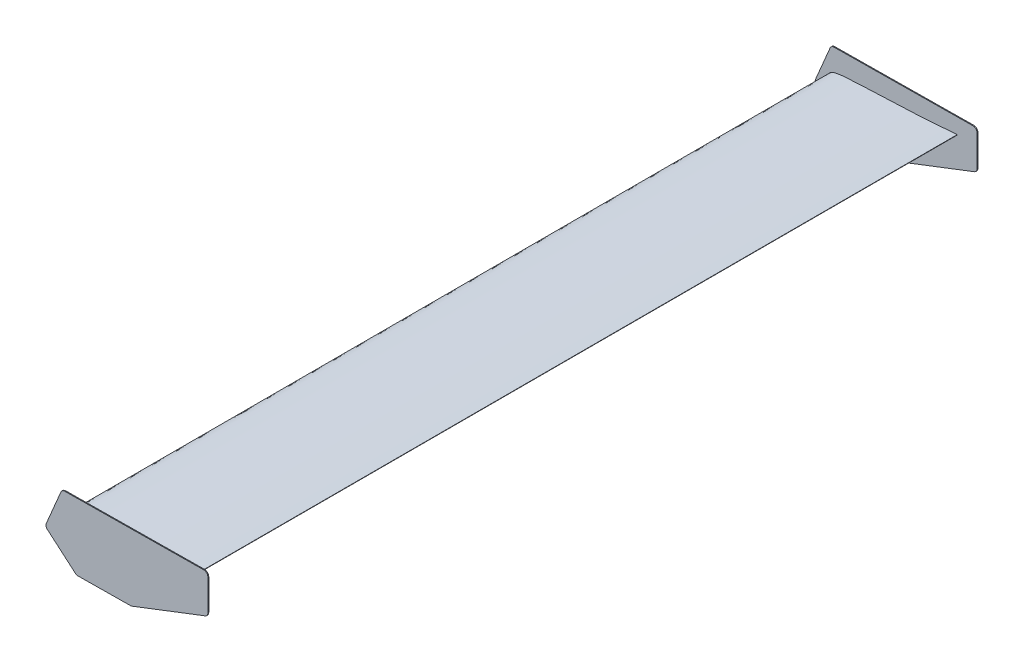
ISO-10303-21;
HEADER;
FILE_DESCRIPTION(('STEP AP214'),'2;1');
FILE_NAME('part.step','',(''),(''),'','','');
FILE_SCHEMA(('AUTOMOTIVE_DESIGN { 1 0 10303 214 1 1 1 1 }'));
ENDSEC;
DATA;
#1=APPLICATION_CONTEXT('core data for automotive mechanical design processes');
#2=APPLICATION_PROTOCOL_DEFINITION('international standard','automotive_design',2000,#1);
#3=PRODUCT_CONTEXT('',#1,'mechanical');
#4=PRODUCT('Part','Part','',(#3));
#5=PRODUCT_RELATED_PRODUCT_CATEGORY('part','',(#4));
#6=PRODUCT_DEFINITION_FORMATION('','',#4);
#7=PRODUCT_DEFINITION_CONTEXT('part definition',#1,'design');
#8=PRODUCT_DEFINITION('design','',#6,#7);
#9=PRODUCT_DEFINITION_SHAPE('','',#8);
#10=(LENGTH_UNIT() NAMED_UNIT(*) SI_UNIT(.MILLI.,.METRE.));
#11=(NAMED_UNIT(*) PLANE_ANGLE_UNIT() SI_UNIT($,.RADIAN.));
#12=(NAMED_UNIT(*) SI_UNIT($,.STERADIAN.) SOLID_ANGLE_UNIT());
#13=UNCERTAINTY_MEASURE_WITH_UNIT(LENGTH_MEASURE(1.E-05),#10,'distance_accuracy_value','');
#14=(GEOMETRIC_REPRESENTATION_CONTEXT(3) GLOBAL_UNCERTAINTY_ASSIGNED_CONTEXT((#13)) GLOBAL_UNIT_ASSIGNED_CONTEXT((#10,
#11,#12)) REPRESENTATION_CONTEXT('',''));
#15=CARTESIAN_POINT('',(0.,0.,0.));
#16=DIRECTION('',(0.,0.,1.));
#17=DIRECTION('',(1.,0.,0.));
#18=AXIS2_PLACEMENT_3D('',#15,#16,#17);
#19=CARTESIAN_POINT('',(0.,0.,899.));
#20=DIRECTION('',(0.,0.,-1.));
#21=DIRECTION('',(-1.,0.,0.));
#22=AXIS2_PLACEMENT_3D('',#19,#20,#21);
#23=PLANE('',#22);
#24=DIRECTION('',(-0.999947428083981,-0.0102538318804609,0.));
#25=VECTOR('',#24,1.);
#26=CARTESIAN_POINT('',(4.19836461655942,59.4066569608688,899.));
#27=LINE('',#26,#25);
#28=CARTESIAN_POINT('',(335.564783335885,62.8046111462092,899.));
#29=VERTEX_POINT('',#28);
#30=CARTESIAN_POINT('',(10.7496298097369,59.4738360644981,899.));
#31=VERTEX_POINT('',#30);
#32=EDGE_CURVE('E240',#29,#31,#27,.T.);
#33=ORIENTED_EDGE('',*,*,#32,.F.);
#34=CARTESIAN_POINT('',(335.667321654689,52.8051368653694,899.));
#35=DIRECTION('',(0.,0.,-1.));
#36=DIRECTION('',(-1.,0.,0.));
#37=AXIS2_PLACEMENT_3D('',#34,#35,#36);
#38=CIRCLE('',#37,10.);
#39=CARTESIAN_POINT('',(345.667321654689,52.8051368653694,899.));
#40=VERTEX_POINT('',#39);
#41=EDGE_CURVE('E277',#29,#40,#38,.T.);
#42=ORIENTED_EDGE('',*,*,#41,.T.);
#43=DIRECTION('',(0.,1.,0.));
#44=VECTOR('',#43,1.);
#45=CARTESIAN_POINT('',(345.667321654689,62.908206321893,899.));
#46=LINE('',#45,#44);
#47=CARTESIAN_POINT('',(345.667321654689,-19.4543841415105,899.));
#48=VERTEX_POINT('',#47);
#49=EDGE_CURVE('E439',#48,#40,#46,.T.);
#50=ORIENTED_EDGE('',*,*,#49,.F.);
#51=CARTESIAN_POINT('',(335.667321654689,-19.4543841415105,899.));
#52=DIRECTION('',(0.,0.,-1.));
#53=DIRECTION('',(-1.,0.,0.));
#54=AXIS2_PLACEMENT_3D('',#51,#52,#53);
#55=CIRCLE('',#54,10.);
#56=CARTESIAN_POINT('',(339.261892028957,-28.7860004979859,899.));
#57=VERTEX_POINT('',#56);
#58=EDGE_CURVE('E274',#48,#57,#55,.T.);
#59=ORIENTED_EDGE('',*,*,#58,.T.);
#60=DIRECTION('',(0.93316163564754,0.35945703742674,0.));
#61=VECTOR('',#60,1.);
#62=CARTESIAN_POINT('',(166.275090380422,-95.4211051348804,899.));
#63=LINE('',#62,#61);
#64=CARTESIAN_POINT('',(167.960784377593,-94.7717700710672,899.));
#65=VERTEX_POINT('',#64);
#66=EDGE_CURVE('E474',#65,#57,#63,.T.);
#67=ORIENTED_EDGE('',*,*,#66,.F.);
#68=CARTESIAN_POINT('',(164.366214003326,-85.4401537145918,899.));
#69=DIRECTION('',(0.,0.,-1.));
#70=DIRECTION('',(-1.,0.,0.));
#71=AXIS2_PLACEMENT_3D('',#68,#69,#70);
#72=CIRCLE('',#71,10.);
#73=CARTESIAN_POINT('',(164.46875232213,-95.4396279954316,899.));
#74=VERTEX_POINT('',#73);
#75=EDGE_CURVE('E271',#65,#74,#72,.T.);
#76=ORIENTED_EDGE('',*,*,#75,.T.);
#77=DIRECTION('',(0.99994742808398,0.010253831880461,0.));
#78=VECTOR('',#77,1.);
#79=CARTESIAN_POINT('',(38.2575012573376,-96.7338449847395,899.));
#80=LINE('',#79,#78);
#81=CARTESIAN_POINT('',(42.0078617050286,-96.6953873974287,899.));
#82=VERTEX_POINT('',#81);
#83=EDGE_CURVE('E470',#82,#74,#80,.T.);
#84=ORIENTED_EDGE('',*,*,#83,.F.);
#85=CARTESIAN_POINT('',(41.905323386224,-86.6959131165889,899.));
#86=DIRECTION('',(0.,0.,-1.));
#87=DIRECTION('',(-1.,0.,0.));
#88=AXIS2_PLACEMENT_3D('',#85,#86,#87);
#89=CIRCLE('',#88,10.);
#90=CARTESIAN_POINT('',(35.4068383285812,-94.2965507185006,899.));
#91=VERTEX_POINT('',#90);
#92=EDGE_CURVE('E262',#82,#91,#89,.T.);
#93=ORIENTED_EDGE('',*,*,#92,.T.);
#94=DIRECTION('',(0.760063760191166,-0.649848505764278,0.));
#95=VECTOR('',#94,1.);
#96=CARTESIAN_POINT('',(-35.2909208199958,-33.8505255955157,899.));
#97=LINE('',#96,#95);
#98=CARTESIAN_POINT('',(-29.7260776200808,-38.6084225348037,899.));
#99=VERTEX_POINT('',#98);
#100=EDGE_CURVE('E466',#99,#91,#97,.T.);
#101=ORIENTED_EDGE('',*,*,#100,.F.);
#102=CARTESIAN_POINT('',(-23.227592562438,-31.007784932892,899.));
#103=DIRECTION('',(0.,0.,-1.));
#104=DIRECTION('',(-1.,0.,0.));
#105=AXIS2_PLACEMENT_3D('',#102,#103,#104);
#106=CIRCLE('',#105,10.);
#107=CARTESIAN_POINT('',(-32.4360484248066,-27.1085105605493,899.));
#108=VERTEX_POINT('',#107);
#109=EDGE_CURVE('E265',#99,#108,#106,.T.);
#110=ORIENTED_EDGE('',*,*,#109,.T.);
#111=DIRECTION('',(-0.38992743723427,-0.920845586236864,0.));
#112=VECTOR('',#111,1.);
#113=CARTESIAN_POINT('',(4.19836461655942,59.4066569608688,899.));
#114=LINE('',#113,#112);
#115=CARTESIAN_POINT('',(1.64371226617284,53.373636156001,899.));
#116=VERTEX_POINT('',#115);
#117=EDGE_CURVE('E462',#116,#108,#114,.T.);
#118=ORIENTED_EDGE('',*,*,#117,.F.);
#119=CARTESIAN_POINT('',(10.8521681285415,49.4743617836583,899.));
#120=DIRECTION('',(0.,0.,-1.));
#121=DIRECTION('',(-1.,0.,0.));
#122=AXIS2_PLACEMENT_3D('',#119,#120,#121);
#123=CIRCLE('',#122,10.);
#124=EDGE_CURVE('E268',#116,#31,#123,.T.);
#125=ORIENTED_EDGE('',*,*,#124,.T.);
#126=EDGE_LOOP('',(#33,#42,#50,#59,#67,#76,#84,#93,#101,#110,#118,#125));
#127=FACE_BOUND('',#126,.T.);
#128=CARTESIAN_POINT('',(298.858661962773,26.146744918269,899.));
#129=CARTESIAN_POINT('',(293.875098897628,25.7402437529243,899.));
#130=CARTESIAN_POINT('',(283.907703671886,24.9272194725548,899.));
#131=CARTESIAN_POINT('',(263.958755111524,23.4712027450885,899.));
#132=CARTESIAN_POINT('',(239.014705435732,21.7211585698651,899.));
#133=CARTESIAN_POINT('',(209.05688021206,19.9264727803739,899.));
#134=CARTESIAN_POINT('',(179.077245244658,18.4128529344905,899.));
#135=CARTESIAN_POINT('',(149.084537794544,17.0843515729155,899.));
#136=CARTESIAN_POINT('',(119.092912388185,15.631028880742,899.));
#137=CARTESIAN_POINT('',(94.0863260096571,14.6807948933268,899.));
#138=CARTESIAN_POINT('',(74.0797916332806,13.8955105364958,899.));
#139=CARTESIAN_POINT('',(59.0737262089093,13.4046803960203,899.));
#140=CARTESIAN_POINT('',(44.0897035151737,12.5347752195751,899.));
#141=CARTESIAN_POINT('',(31.6255943617001,11.4957953126591,899.));
#142=CARTESIAN_POINT('',(21.6908210501264,10.1701683604488,899.));
#143=CARTESIAN_POINT('',(14.2442689255395,8.86509196122313,899.));
#144=CARTESIAN_POINT('',(8.00252161775655,7.02249510738592,899.));
#145=CARTESIAN_POINT('',(2.8330981317532,4.64399965609503,899.));
#146=CARTESIAN_POINT('',(-1.97377298268309,-0.694626299144179,899.));
#147=CARTESIAN_POINT('',(3.42072163390064,-6.66868321755238,899.));
#148=CARTESIAN_POINT('',(9.32741175996035,-10.1631846294058,899.));
#149=CARTESIAN_POINT('',(16.0240994582126,-12.9330140371364,899.));
#150=CARTESIAN_POINT('',(23.8016957886575,-15.357547658098,899.));
#151=CARTESIAN_POINT('',(34.0458219358899,-17.7529477555712,899.));
#152=CARTESIAN_POINT('',(46.7570838533902,-19.9034090787596,899.));
#153=CARTESIAN_POINT('',(61.9923378643766,-21.2894298389192,899.));
#154=CARTESIAN_POINT('',(77.120912857152,-21.8158418037218,899.));
#155=CARTESIAN_POINT('',(97.1755249203744,-21.4770230061346,899.));
#156=CARTESIAN_POINT('',(122.142095145181,-19.3055456669441,899.));
#157=CARTESIAN_POINT('',(151.882741019784,-14.7761739770179,899.));
#158=CARTESIAN_POINT('',(181.524502490393,-9.06890348675988,899.));
#159=CARTESIAN_POINT('',(211.041204877206,-2.10519662162151,899.));
#160=CARTESIAN_POINT('',(240.497927233197,5.82563121160304,899.));
#161=CARTESIAN_POINT('',(264.903410228121,13.3990399801146,899.));
#162=CARTESIAN_POINT('',(284.370122597568,20.0275859686937,899.));
#163=CARTESIAN_POINT('',(294.065979012411,23.5860764889582,899.));
#164=CARTESIAN_POINT('',(298.925633244102,25.3696253345,899.));
#165=B_SPLINE_CURVE_WITH_KNOTS('',3,(#128,#129,#130,#131,#132,#133,#134,#135,#136,#137,#138,
#139,#140,#141,#142,#143,#144,#145,#146,#147,#148,#149,#150,#151,#152,#153,#154,#155,#156,#157,
#158,#159,#160,#161,#162,#163,#164),.UNSPECIFIED.,.F.,.F.,(4,1,1,1,1,1,1,1,1,1,1,1,1,1,1,1,1,1,
1,1,1,1,1,1,1,1,1,1,1,1,1,1,1,1,4),(0.,0.0244427721061945,0.0488868640389345,0.0977785916589877,
0.146679776180424,0.195594373169575,0.244518129566772,0.293441885963969,0.342378242904188,
0.366848716418896,0.391319189933605,0.415771101598765,0.440213629284816,0.45244886604217,
0.464730985941134,0.477233997408243,0.483852229950494,0.493136970824156,0.506538949171679,
0.514213997148271,0.528080018214651,0.541297784208939,0.554174880744231,0.579429854643616,
0.604273702829676,0.628897262955146,0.653399405638713,0.702284461010814,0.751259990775971,
0.800413393105454,0.849809284276661,0.899479567348494,0.949512346609459,0.974695114289043,1.),.UNSPECIFIED.);
#166=CARTESIAN_POINT('',(298.925633244102,25.3696253345,899.));
#167=VERTEX_POINT('',#166);
#168=CARTESIAN_POINT('',(298.858661962773,26.146744918269,899.));
#169=VERTEX_POINT('',#168);
#170=EDGE_CURVE('E252',#167,#169,#165,.F.);
#171=ORIENTED_EDGE('',*,*,#170,.F.);
#172=DIRECTION('',(0.0858606170879467,-0.996307158678124,0.));
#173=VECTOR('',#172,1.);
#174=CARTESIAN_POINT('',(298.858661962773,26.146744918269,899.));
#175=LINE('',#174,#173);
#176=EDGE_CURVE('E245',#169,#167,#175,.T.);
#177=ORIENTED_EDGE('',*,*,#176,.F.);
#178=EDGE_LOOP('',(#171,#177));
#179=FACE_BOUND('',#178,.T.);
#180=ADVANCED_FACE('F47',(#127,#179),#23,.T.);
#181=CARTESIAN_POINT('',(4.19836461655942,59.4066569608688,901.));
#182=DIRECTION('',(0.0102538318804609,-0.999947428083981,0.));
#183=DIRECTION('',(0.999947428083981,0.0102538318804609,0.));
#184=AXIS2_PLACEMENT_3D('',#181,#182,#183);
#185=PLANE('',#184);
#186=DIRECTION('',(-0.999947428083981,-0.0102538318804609,0.));
#187=VECTOR('',#186,1.);
#188=CARTESIAN_POINT('',(4.19836461655942,59.4066569608688,901.));
#189=LINE('',#188,#187);
#190=CARTESIAN_POINT('',(335.564783335885,62.8046111462092,901.));
#191=VERTEX_POINT('',#190);
#192=CARTESIAN_POINT('',(10.7496298097369,59.4738360644981,901.));
#193=VERTEX_POINT('',#192);
#194=EDGE_CURVE('E431',#191,#193,#189,.T.);
#195=ORIENTED_EDGE('',*,*,#194,.F.);
#196=DIRECTION('',(0.,0.,-1.));
#197=VECTOR('',#196,1.);
#198=CARTESIAN_POINT('',(335.564783335885,62.8046111462092,901.));
#199=LINE('',#198,#197);
#200=EDGE_CURVE('E258',#191,#29,#199,.T.);
#201=ORIENTED_EDGE('',*,*,#200,.T.);
#202=ORIENTED_EDGE('',*,*,#32,.T.);
#203=DIRECTION('',(0.,0.,-1.));
#204=VECTOR('',#203,1.);
#205=CARTESIAN_POINT('',(10.7496298097369,59.4738360644981,901.));
#206=LINE('',#205,#204);
#207=EDGE_CURVE('E250',#31,#193,#206,.F.);
#208=ORIENTED_EDGE('',*,*,#207,.T.);
#209=EDGE_LOOP('',(#195,#201,#202,#208));
#210=FACE_BOUND('',#209,.T.);
#211=ADVANCED_FACE('F546',(#210),#185,.F.);
#212=CARTESIAN_POINT('',(4.19836461655942,59.4066569608688,901.));
#213=DIRECTION('',(0.920845586236864,-0.38992743723427,0.));
#214=DIRECTION('',(0.38992743723427,0.920845586236864,0.));
#215=AXIS2_PLACEMENT_3D('',#212,#213,#214);
#216=PLANE('',#215);
#217=DIRECTION('',(-0.38992743723427,-0.920845586236864,0.));
#218=VECTOR('',#217,1.);
#219=CARTESIAN_POINT('',(4.19836461655942,59.4066569608688,901.));
#220=LINE('',#219,#218);
#221=CARTESIAN_POINT('',(1.64371226617284,53.373636156001,901.));
#222=VERTEX_POINT('',#221);
#223=CARTESIAN_POINT('',(-32.4360484248066,-27.1085105605493,901.));
#224=VERTEX_POINT('',#223);
#225=EDGE_CURVE('E438',#222,#224,#220,.T.);
#226=ORIENTED_EDGE('',*,*,#225,.F.);
#227=DIRECTION('',(0.,0.,-1.));
#228=VECTOR('',#227,1.);
#229=CARTESIAN_POINT('',(1.64371226617284,53.373636156001,901.));
#230=LINE('',#229,#228);
#231=EDGE_CURVE('E322',#222,#116,#230,.T.);
#232=ORIENTED_EDGE('',*,*,#231,.T.);
#233=ORIENTED_EDGE('',*,*,#117,.T.);
#234=DIRECTION('',(0.,0.,-1.));
#235=VECTOR('',#234,1.);
#236=CARTESIAN_POINT('',(-32.4360484248066,-27.1085105605493,901.));
#237=LINE('',#236,#235);
#238=EDGE_CURVE('E319',#108,#224,#237,.F.);
#239=ORIENTED_EDGE('',*,*,#238,.T.);
#240=EDGE_LOOP('',(#226,#232,#233,#239));
#241=FACE_BOUND('',#240,.T.);
#242=ADVANCED_FACE('F552',(#241),#216,.F.);
#243=CARTESIAN_POINT('',(-35.2909208199958,-33.8505255955157,901.));
#244=DIRECTION('',(0.649848505764278,0.760063760191167,0.));
#245=DIRECTION('',(-0.760063760191167,0.649848505764278,0.));
#246=AXIS2_PLACEMENT_3D('',#243,#244,#245);
#247=PLANE('',#246);
#248=DIRECTION('',(0.760063760191166,-0.649848505764278,0.));
#249=VECTOR('',#248,1.);
#250=CARTESIAN_POINT('',(-35.2909208199958,-33.8505255955157,901.));
#251=LINE('',#250,#249);
#252=CARTESIAN_POINT('',(-29.7260776200808,-38.6084225348037,901.));
#253=VERTEX_POINT('',#252);
#254=CARTESIAN_POINT('',(35.4068383285812,-94.2965507185006,901.));
#255=VERTEX_POINT('',#254);
#256=EDGE_CURVE('E443',#253,#255,#251,.T.);
#257=ORIENTED_EDGE('',*,*,#256,.F.);
#258=DIRECTION('',(0.,0.,-1.));
#259=VECTOR('',#258,1.);
#260=CARTESIAN_POINT('',(-29.7260776200808,-38.6084225348037,901.));
#261=LINE('',#260,#259);
#262=EDGE_CURVE('E231',#253,#99,#261,.T.);
#263=ORIENTED_EDGE('',*,*,#262,.T.);
#264=ORIENTED_EDGE('',*,*,#100,.T.);
#265=DIRECTION('',(0.,0.,-1.));
#266=VECTOR('',#265,1.);
#267=CARTESIAN_POINT('',(35.4068383285812,-94.2965507185006,901.));
#268=LINE('',#267,#266);
#269=EDGE_CURVE('E326',#91,#255,#268,.F.);
#270=ORIENTED_EDGE('',*,*,#269,.T.);
#271=EDGE_LOOP('',(#257,#263,#264,#270));
#272=FACE_BOUND('',#271,.T.);
#273=ADVANCED_FACE('F570',(#272),#247,.F.);
#274=CARTESIAN_POINT('',(38.2575012573376,-96.7338449847395,901.));
#275=DIRECTION('',(-0.010253831880461,0.999947428083981,0.));
#276=DIRECTION('',(-0.999947428083981,-0.010253831880461,0.));
#277=AXIS2_PLACEMENT_3D('',#274,#275,#276);
#278=PLANE('',#277);
#279=ORIENTED_EDGE('',*,*,#83,.T.);
#280=DIRECTION('',(0.,0.,-1.));
#281=VECTOR('',#280,1.);
#282=CARTESIAN_POINT('',(164.46875232213,-95.4396279954316,901.));
#283=LINE('',#282,#281);
#284=CARTESIAN_POINT('',(164.46875232213,-95.4396279954316,901.));
#285=VERTEX_POINT('',#284);
#286=EDGE_CURVE('E316',#74,#285,#283,.F.);
#287=ORIENTED_EDGE('',*,*,#286,.T.);
#288=DIRECTION('',(0.99994742808398,0.010253831880461,0.));
#289=VECTOR('',#288,1.);
#290=CARTESIAN_POINT('',(38.2575012573376,-96.7338449847395,901.));
#291=LINE('',#290,#289);
#292=CARTESIAN_POINT('',(42.0078617050286,-96.6953873974287,901.));
#293=VERTEX_POINT('',#292);
#294=EDGE_CURVE('E447',#293,#285,#291,.T.);
#295=ORIENTED_EDGE('',*,*,#294,.F.);
#296=DIRECTION('',(0.,0.,-1.));
#297=VECTOR('',#296,1.);
#298=CARTESIAN_POINT('',(42.0078617050286,-96.6953873974287,901.));
#299=LINE('',#298,#297);
#300=EDGE_CURVE('E312',#293,#82,#299,.T.);
#301=ORIENTED_EDGE('',*,*,#300,.T.);
#302=EDGE_LOOP('',(#279,#287,#295,#301));
#303=FACE_BOUND('',#302,.T.);
#304=ADVANCED_FACE('F566',(#303),#278,.F.);
#305=CARTESIAN_POINT('',(166.275090380422,-95.4211051348804,901.));
#306=DIRECTION('',(-0.359457037426739,0.93316163564754,0.));
#307=DIRECTION('',(-0.93316163564754,-0.35945703742674,0.));
#308=AXIS2_PLACEMENT_3D('',#305,#306,#307);
#309=PLANE('',#308);
#310=ORIENTED_EDGE('',*,*,#66,.T.);
#311=DIRECTION('',(0.,0.,-1.));
#312=VECTOR('',#311,1.);
#313=CARTESIAN_POINT('',(339.261892028957,-28.7860004979859,901.));
#314=LINE('',#313,#312);
#315=CARTESIAN_POINT('',(339.261892028957,-28.7860004979859,901.));
#316=VERTEX_POINT('',#315);
#317=EDGE_CURVE('E309',#57,#316,#314,.F.);
#318=ORIENTED_EDGE('',*,*,#317,.T.);
#319=DIRECTION('',(0.93316163564754,0.35945703742674,0.));
#320=VECTOR('',#319,1.);
#321=CARTESIAN_POINT('',(166.275090380422,-95.4211051348804,901.));
#322=LINE('',#321,#320);
#323=CARTESIAN_POINT('',(167.960784377593,-94.7717700710672,901.));
#324=VERTEX_POINT('',#323);
#325=EDGE_CURVE('E451',#324,#316,#322,.T.);
#326=ORIENTED_EDGE('',*,*,#325,.F.);
#327=DIRECTION('',(0.,0.,-1.));
#328=VECTOR('',#327,1.);
#329=CARTESIAN_POINT('',(167.960784377593,-94.7717700710672,901.));
#330=LINE('',#329,#328);
#331=EDGE_CURVE('E305',#324,#65,#330,.T.);
#332=ORIENTED_EDGE('',*,*,#331,.T.);
#333=EDGE_LOOP('',(#310,#318,#326,#332));
#334=FACE_BOUND('',#333,.T.);
#335=ADVANCED_FACE('F562',(#334),#309,.F.);
#336=CARTESIAN_POINT('',(345.667321654689,62.908206321893,901.));
#337=DIRECTION('',(-1.,0.,0.));
#338=DIRECTION('',(0.,0.,1.));
#339=AXIS2_PLACEMENT_3D('',#336,#337,#338);
#340=PLANE('',#339);
#341=ORIENTED_EDGE('',*,*,#49,.T.);
#342=DIRECTION('',(0.,0.,-1.));
#343=VECTOR('',#342,1.);
#344=CARTESIAN_POINT('',(345.667321654689,52.8051368653694,901.));
#345=LINE('',#344,#343);
#346=CARTESIAN_POINT('',(345.667321654689,52.8051368653694,901.));
#347=VERTEX_POINT('',#346);
#348=EDGE_CURVE('E284',#40,#347,#345,.F.);
#349=ORIENTED_EDGE('',*,*,#348,.T.);
#350=DIRECTION('',(0.,1.,0.));
#351=VECTOR('',#350,1.);
#352=CARTESIAN_POINT('',(345.667321654689,62.908206321893,901.));
#353=LINE('',#352,#351);
#354=CARTESIAN_POINT('',(345.667321654689,-19.4543841415105,901.));
#355=VERTEX_POINT('',#354);
#356=EDGE_CURVE('E455',#355,#347,#353,.T.);
#357=ORIENTED_EDGE('',*,*,#356,.F.);
#358=DIRECTION('',(0.,0.,-1.));
#359=VECTOR('',#358,1.);
#360=CARTESIAN_POINT('',(345.667321654689,-19.4543841415105,901.));
#361=LINE('',#360,#359);
#362=EDGE_CURVE('E280',#355,#48,#361,.T.);
#363=ORIENTED_EDGE('',*,*,#362,.T.);
#364=EDGE_LOOP('',(#341,#349,#357,#363));
#365=FACE_BOUND('',#364,.T.);
#366=ADVANCED_FACE('F559',(#365),#340,.F.);
#367=CARTESIAN_POINT('',(0.,0.,901.));
#368=DIRECTION('',(0.,0.,-1.));
#369=DIRECTION('',(-1.,0.,0.));
#370=AXIS2_PLACEMENT_3D('',#367,#368,#369);
#371=PLANE('',#370);
#372=ORIENTED_EDGE('',*,*,#356,.T.);
#373=CARTESIAN_POINT('',(335.667321654689,52.8051368653694,901.));
#374=DIRECTION('',(0.,0.,-1.));
#375=DIRECTION('',(-1.,0.,0.));
#376=AXIS2_PLACEMENT_3D('',#373,#374,#375);
#377=CIRCLE('',#376,10.);
#378=EDGE_CURVE('E302',#347,#191,#377,.F.);
#379=ORIENTED_EDGE('',*,*,#378,.T.);
#380=ORIENTED_EDGE('',*,*,#194,.T.);
#381=CARTESIAN_POINT('',(10.8521681285415,49.4743617836583,901.));
#382=DIRECTION('',(0.,0.,-1.));
#383=DIRECTION('',(-1.,0.,0.));
#384=AXIS2_PLACEMENT_3D('',#381,#382,#383);
#385=CIRCLE('',#384,10.);
#386=EDGE_CURVE('E293',#193,#222,#385,.F.);
#387=ORIENTED_EDGE('',*,*,#386,.T.);
#388=ORIENTED_EDGE('',*,*,#225,.T.);
#389=CARTESIAN_POINT('',(-23.227592562438,-31.007784932892,901.));
#390=DIRECTION('',(0.,0.,-1.));
#391=DIRECTION('',(-1.,0.,0.));
#392=AXIS2_PLACEMENT_3D('',#389,#390,#391);
#393=CIRCLE('',#392,10.);
#394=EDGE_CURVE('E290',#224,#253,#393,.F.);
#395=ORIENTED_EDGE('',*,*,#394,.T.);
#396=ORIENTED_EDGE('',*,*,#256,.T.);
#397=CARTESIAN_POINT('',(41.905323386224,-86.6959131165889,901.));
#398=DIRECTION('',(0.,0.,-1.));
#399=DIRECTION('',(-1.,0.,0.));
#400=AXIS2_PLACEMENT_3D('',#397,#398,#399);
#401=CIRCLE('',#400,10.);
#402=EDGE_CURVE('E287',#255,#293,#401,.F.);
#403=ORIENTED_EDGE('',*,*,#402,.T.);
#404=ORIENTED_EDGE('',*,*,#294,.T.);
#405=CARTESIAN_POINT('',(164.366214003326,-85.4401537145918,901.));
#406=DIRECTION('',(0.,0.,-1.));
#407=DIRECTION('',(-1.,0.,0.));
#408=AXIS2_PLACEMENT_3D('',#405,#406,#407);
#409=CIRCLE('',#408,10.);
#410=EDGE_CURVE('E296',#285,#324,#409,.F.);
#411=ORIENTED_EDGE('',*,*,#410,.T.);
#412=ORIENTED_EDGE('',*,*,#325,.T.);
#413=CARTESIAN_POINT('',(335.667321654689,-19.4543841415105,901.));
#414=DIRECTION('',(0.,0.,-1.));
#415=DIRECTION('',(-1.,0.,0.));
#416=AXIS2_PLACEMENT_3D('',#413,#414,#415);
#417=CIRCLE('',#416,10.);
#418=EDGE_CURVE('E299',#316,#355,#417,.F.);
#419=ORIENTED_EDGE('',*,*,#418,.T.);
#420=EDGE_LOOP('',(#372,#379,#380,#387,#388,#395,#396,#403,#404,#411,#412,#419));
#421=FACE_BOUND('',#420,.T.);
#422=ADVANCED_FACE('F497',(#421),#371,.F.);
#423=CARTESIAN_POINT('',(298.858661962773,26.146744918269,900.));
#424=CARTESIAN_POINT('',(293.875098897628,25.7402437529243,900.));
#425=CARTESIAN_POINT('',(283.907703671886,24.9272194725548,900.));
#426=CARTESIAN_POINT('',(263.958755111524,23.4712027450885,900.));
#427=CARTESIAN_POINT('',(239.014705435732,21.7211585698651,900.));
#428=CARTESIAN_POINT('',(209.05688021206,19.9264727803739,900.));
#429=CARTESIAN_POINT('',(179.077245244658,18.4128529344905,900.));
#430=CARTESIAN_POINT('',(149.084537794544,17.0843515729155,900.));
#431=CARTESIAN_POINT('',(119.092912388185,15.631028880742,900.));
#432=CARTESIAN_POINT('',(94.0863260096571,14.6807948933268,900.));
#433=CARTESIAN_POINT('',(74.0797916332806,13.8955105364958,900.));
#434=CARTESIAN_POINT('',(59.0737262089093,13.4046803960203,900.));
#435=CARTESIAN_POINT('',(44.0897035151737,12.5347752195751,900.));
#436=CARTESIAN_POINT('',(31.6255943617001,11.4957953126591,900.));
#437=CARTESIAN_POINT('',(21.6908210501264,10.1701683604488,900.));
#438=CARTESIAN_POINT('',(14.2442689255395,8.86509196122313,900.));
#439=CARTESIAN_POINT('',(8.00252161775655,7.02249510738592,900.));
#440=CARTESIAN_POINT('',(2.8330981317532,4.64399965609503,900.));
#441=CARTESIAN_POINT('',(-1.97377298268309,-0.694626299144179,900.));
#442=CARTESIAN_POINT('',(3.42072163390064,-6.66868321755238,900.));
#443=CARTESIAN_POINT('',(9.32741175996035,-10.1631846294058,900.));
#444=CARTESIAN_POINT('',(16.0240994582126,-12.9330140371364,900.));
#445=CARTESIAN_POINT('',(23.8016957886575,-15.357547658098,900.));
#446=CARTESIAN_POINT('',(34.0458219358899,-17.7529477555712,900.));
#447=CARTESIAN_POINT('',(46.7570838533902,-19.9034090787596,900.));
#448=CARTESIAN_POINT('',(61.9923378643766,-21.2894298389192,900.));
#449=CARTESIAN_POINT('',(77.120912857152,-21.8158418037218,900.));
#450=CARTESIAN_POINT('',(97.1755249203744,-21.4770230061346,900.));
#451=CARTESIAN_POINT('',(122.142095145181,-19.3055456669441,900.));
#452=CARTESIAN_POINT('',(151.882741019784,-14.7761739770179,900.));
#453=CARTESIAN_POINT('',(181.524502490393,-9.06890348675988,900.));
#454=CARTESIAN_POINT('',(211.041204877206,-2.10519662162151,900.));
#455=CARTESIAN_POINT('',(240.497927233197,5.82563121160304,900.));
#456=CARTESIAN_POINT('',(264.903410228121,13.3990399801146,900.));
#457=CARTESIAN_POINT('',(284.370122597568,20.0275859686937,900.));
#458=CARTESIAN_POINT('',(294.065979012411,23.5860764889582,900.));
#459=CARTESIAN_POINT('',(298.925633244102,25.3696253345,900.));
#460=B_SPLINE_CURVE_WITH_KNOTS('',3,(#423,#424,#425,#426,#427,#428,#429,#430,#431,#432,#433,
#434,#435,#436,#437,#438,#439,#440,#441,#442,#443,#444,#445,#446,#447,#448,#449,#450,#451,#452,
#453,#454,#455,#456,#457,#458,#459),.UNSPECIFIED.,.F.,.F.,(4,1,1,1,1,1,1,1,1,1,1,1,1,1,1,1,1,1,
1,1,1,1,1,1,1,1,1,1,1,1,1,1,1,1,4),(0.,0.0244427721061945,0.0488868640389345,0.0977785916589877,
0.146679776180424,0.195594373169575,0.244518129566772,0.293441885963969,0.342378242904188,
0.366848716418896,0.391319189933605,0.415771101598765,0.440213629284816,0.45244886604217,
0.464730985941134,0.477233997408243,0.483852229950494,0.493136970824156,0.506538949171679,
0.514213997148271,0.528080018214651,0.541297784208939,0.554174880744231,0.579429854643616,
0.604273702829676,0.628897262955146,0.653399405638713,0.702284461010814,0.751259990775971,
0.800413393105454,0.849809284276661,0.899479567348494,0.949512346609459,0.974695114289043,1.),.UNSPECIFIED.);
#461=DIRECTION('',(0.,0.,-1.));
#462=VECTOR('',#461,1.);
#463=SURFACE_OF_LINEAR_EXTRUSION('',#460,#462);
#464=DIRECTION('',(0.,0.,-1.));
#465=VECTOR('',#464,1.);
#466=CARTESIAN_POINT('',(298.858661962773,26.146744918269,900.));
#467=LINE('',#466,#465);
#468=CARTESIAN_POINT('',(298.858661962773,26.146744918269,-899.));
#469=VERTEX_POINT('',#468);
#470=EDGE_CURVE('E238',#169,#469,#467,.T.);
#471=ORIENTED_EDGE('',*,*,#470,.T.);
#472=CARTESIAN_POINT('',(298.858661962773,26.146744918269,-899.));
#473=CARTESIAN_POINT('',(293.875098897628,25.7402437529243,-899.));
#474=CARTESIAN_POINT('',(283.907703671886,24.9272194725548,-899.));
#475=CARTESIAN_POINT('',(263.958755111524,23.4712027450885,-899.));
#476=CARTESIAN_POINT('',(239.014705435732,21.7211585698651,-899.));
#477=CARTESIAN_POINT('',(209.05688021206,19.9264727803739,-899.));
#478=CARTESIAN_POINT('',(179.077245244658,18.4128529344905,-899.));
#479=CARTESIAN_POINT('',(149.084537794544,17.0843515729155,-899.));
#480=CARTESIAN_POINT('',(119.092912388185,15.631028880742,-899.));
#481=CARTESIAN_POINT('',(94.0863260096571,14.6807948933268,-899.));
#482=CARTESIAN_POINT('',(74.0797916332806,13.8955105364958,-899.));
#483=CARTESIAN_POINT('',(59.0737262089093,13.4046803960203,-899.));
#484=CARTESIAN_POINT('',(44.0897035151737,12.5347752195751,-899.));
#485=CARTESIAN_POINT('',(31.6255943617001,11.4957953126591,-899.));
#486=CARTESIAN_POINT('',(21.6908210501264,10.1701683604488,-899.));
#487=CARTESIAN_POINT('',(14.2442689255395,8.86509196122313,-899.));
#488=CARTESIAN_POINT('',(8.00252161775655,7.02249510738592,-899.));
#489=CARTESIAN_POINT('',(2.8330981317532,4.64399965609503,-899.));
#490=CARTESIAN_POINT('',(-1.97377298268309,-0.694626299144179,-899.));
#491=CARTESIAN_POINT('',(3.42072163390064,-6.66868321755238,-899.));
#492=CARTESIAN_POINT('',(9.32741175996035,-10.1631846294058,-899.));
#493=CARTESIAN_POINT('',(16.0240994582126,-12.9330140371364,-899.));
#494=CARTESIAN_POINT('',(23.8016957886575,-15.357547658098,-899.));
#495=CARTESIAN_POINT('',(34.0458219358899,-17.7529477555712,-899.));
#496=CARTESIAN_POINT('',(46.7570838533902,-19.9034090787596,-899.));
#497=CARTESIAN_POINT('',(61.9923378643766,-21.2894298389192,-899.));
#498=CARTESIAN_POINT('',(77.120912857152,-21.8158418037218,-899.));
#499=CARTESIAN_POINT('',(97.1755249203744,-21.4770230061346,-899.));
#500=CARTESIAN_POINT('',(122.142095145181,-19.3055456669441,-899.));
#501=CARTESIAN_POINT('',(151.882741019784,-14.7761739770179,-899.));
#502=CARTESIAN_POINT('',(181.524502490393,-9.06890348675988,-899.));
#503=CARTESIAN_POINT('',(211.041204877206,-2.10519662162151,-899.));
#504=CARTESIAN_POINT('',(240.497927233197,5.82563121160304,-899.));
#505=CARTESIAN_POINT('',(264.903410228121,13.3990399801146,-899.));
#506=CARTESIAN_POINT('',(284.370122597568,20.0275859686937,-899.));
#507=CARTESIAN_POINT('',(294.065979012411,23.5860764889582,-899.));
#508=CARTESIAN_POINT('',(298.925633244102,25.3696253345,-899.));
#509=B_SPLINE_CURVE_WITH_KNOTS('',3,(#472,#473,#474,#475,#476,#477,#478,#479,#480,#481,#482,
#483,#484,#485,#486,#487,#488,#489,#490,#491,#492,#493,#494,#495,#496,#497,#498,#499,#500,#501,
#502,#503,#504,#505,#506,#507,#508),.UNSPECIFIED.,.F.,.F.,(4,1,1,1,1,1,1,1,1,1,1,1,1,1,1,1,1,1,
1,1,1,1,1,1,1,1,1,1,1,1,1,1,1,1,4),(0.,0.0244427721061945,0.0488868640389345,0.0977785916589877,
0.146679776180424,0.195594373169575,0.244518129566772,0.293441885963969,0.342378242904188,
0.366848716418896,0.391319189933605,0.415771101598765,0.440213629284816,0.45244886604217,
0.464730985941134,0.477233997408243,0.483852229950494,0.493136970824156,0.506538949171679,
0.514213997148271,0.528080018214651,0.541297784208939,0.554174880744231,0.579429854643616,
0.604273702829676,0.628897262955146,0.653399405638713,0.702284461010814,0.751259990775971,
0.800413393105454,0.849809284276661,0.899479567348494,0.949512346609459,0.974695114289043,1.),.UNSPECIFIED.);
#510=CARTESIAN_POINT('',(298.925633244102,25.3696253345,-899.));
#511=VERTEX_POINT('',#510);
#512=EDGE_CURVE('E224',#469,#511,#509,.T.);
#513=ORIENTED_EDGE('',*,*,#512,.T.);
#514=DIRECTION('',(0.,0.,-1.));
#515=VECTOR('',#514,1.);
#516=CARTESIAN_POINT('',(298.925633244102,25.3696253345,900.));
#517=LINE('',#516,#515);
#518=EDGE_CURVE('E237',#167,#511,#517,.T.);
#519=ORIENTED_EDGE('',*,*,#518,.F.);
#520=ORIENTED_EDGE('',*,*,#170,.T.);
#521=EDGE_LOOP('',(#471,#513,#519,#520));
#522=FACE_BOUND('',#521,.T.);
#523=ADVANCED_FACE('F235',(#522),#463,.F.);
#524=CARTESIAN_POINT('',(298.858661962773,26.146744918269,900.));
#525=DIRECTION('',(-0.996307158678124,-0.0858606170879467,0.));
#526=DIRECTION('',(0.0858606170879467,-0.996307158678124,0.));
#527=AXIS2_PLACEMENT_3D('',#524,#525,#526);
#528=PLANE('',#527);
#529=ORIENTED_EDGE('',*,*,#518,.T.);
#530=DIRECTION('',(-0.0858606170879467,0.996307158678124,0.));
#531=VECTOR('',#530,1.);
#532=CARTESIAN_POINT('',(298.858661962773,26.146744918269,-899.));
#533=LINE('',#532,#531);
#534=EDGE_CURVE('E221',#511,#469,#533,.T.);
#535=ORIENTED_EDGE('',*,*,#534,.T.);
#536=ORIENTED_EDGE('',*,*,#470,.F.);
#537=ORIENTED_EDGE('',*,*,#176,.T.);
#538=EDGE_LOOP('',(#529,#535,#536,#537));
#539=FACE_BOUND('',#538,.T.);
#540=ADVANCED_FACE('F244',(#539),#528,.F.);
#541=CARTESIAN_POINT('',(335.667321654689,52.8051368653694,901.));
#542=DIRECTION('',(0.,0.,-1.));
#543=DIRECTION('',(-1.,0.,0.));
#544=AXIS2_PLACEMENT_3D('',#541,#542,#543);
#545=CYLINDRICAL_SURFACE('',#544,10.);
#546=ORIENTED_EDGE('',*,*,#378,.F.);
#547=ORIENTED_EDGE('',*,*,#348,.F.);
#548=ORIENTED_EDGE('',*,*,#41,.F.);
#549=ORIENTED_EDGE('',*,*,#200,.F.);
#550=EDGE_LOOP('',(#546,#547,#548,#549));
#551=FACE_BOUND('',#550,.T.);
#552=ADVANCED_FACE('F499',(#551),#545,.T.);
#553=CARTESIAN_POINT('',(335.667321654689,-19.4543841415105,901.));
#554=DIRECTION('',(0.,0.,-1.));
#555=DIRECTION('',(-1.,0.,0.));
#556=AXIS2_PLACEMENT_3D('',#553,#554,#555);
#557=CYLINDRICAL_SURFACE('',#556,10.);
#558=ORIENTED_EDGE('',*,*,#418,.F.);
#559=ORIENTED_EDGE('',*,*,#317,.F.);
#560=ORIENTED_EDGE('',*,*,#58,.F.);
#561=ORIENTED_EDGE('',*,*,#362,.F.);
#562=EDGE_LOOP('',(#558,#559,#560,#561));
#563=FACE_BOUND('',#562,.T.);
#564=ADVANCED_FACE('F502',(#563),#557,.T.);
#565=CARTESIAN_POINT('',(164.366214003326,-85.4401537145918,901.));
#566=DIRECTION('',(0.,0.,-1.));
#567=DIRECTION('',(-1.,0.,0.));
#568=AXIS2_PLACEMENT_3D('',#565,#566,#567);
#569=CYLINDRICAL_SURFACE('',#568,10.);
#570=ORIENTED_EDGE('',*,*,#410,.F.);
#571=ORIENTED_EDGE('',*,*,#286,.F.);
#572=ORIENTED_EDGE('',*,*,#75,.F.);
#573=ORIENTED_EDGE('',*,*,#331,.F.);
#574=EDGE_LOOP('',(#570,#571,#572,#573));
#575=FACE_BOUND('',#574,.T.);
#576=ADVANCED_FACE('F506',(#575),#569,.T.);
#577=CARTESIAN_POINT('',(10.8521681285415,49.4743617836583,901.));
#578=DIRECTION('',(0.,0.,-1.));
#579=DIRECTION('',(-1.,0.,0.));
#580=AXIS2_PLACEMENT_3D('',#577,#578,#579);
#581=CYLINDRICAL_SURFACE('',#580,10.);
#582=ORIENTED_EDGE('',*,*,#386,.F.);
#583=ORIENTED_EDGE('',*,*,#207,.F.);
#584=ORIENTED_EDGE('',*,*,#124,.F.);
#585=ORIENTED_EDGE('',*,*,#231,.F.);
#586=EDGE_LOOP('',(#582,#583,#584,#585));
#587=FACE_BOUND('',#586,.T.);
#588=ADVANCED_FACE('F510',(#587),#581,.T.);
#589=CARTESIAN_POINT('',(-23.227592562438,-31.007784932892,901.));
#590=DIRECTION('',(0.,0.,-1.));
#591=DIRECTION('',(-1.,0.,0.));
#592=AXIS2_PLACEMENT_3D('',#589,#590,#591);
#593=CYLINDRICAL_SURFACE('',#592,10.);
#594=ORIENTED_EDGE('',*,*,#394,.F.);
#595=ORIENTED_EDGE('',*,*,#238,.F.);
#596=ORIENTED_EDGE('',*,*,#109,.F.);
#597=ORIENTED_EDGE('',*,*,#262,.F.);
#598=EDGE_LOOP('',(#594,#595,#596,#597));
#599=FACE_BOUND('',#598,.T.);
#600=ADVANCED_FACE('F514',(#599),#593,.T.);
#601=CARTESIAN_POINT('',(41.905323386224,-86.6959131165889,901.));
#602=DIRECTION('',(0.,0.,-1.));
#603=DIRECTION('',(-1.,0.,0.));
#604=AXIS2_PLACEMENT_3D('',#601,#602,#603);
#605=CYLINDRICAL_SURFACE('',#604,10.);
#606=ORIENTED_EDGE('',*,*,#402,.F.);
#607=ORIENTED_EDGE('',*,*,#269,.F.);
#608=ORIENTED_EDGE('',*,*,#92,.F.);
#609=ORIENTED_EDGE('',*,*,#300,.F.);
#610=EDGE_LOOP('',(#606,#607,#608,#609));
#611=FACE_BOUND('',#610,.T.);
#612=ADVANCED_FACE('F518',(#611),#605,.T.);
#613=CARTESIAN_POINT('',(0.,0.,-899.));
#614=DIRECTION('',(0.,0.,1.));
#615=DIRECTION('',(-1.,0.,0.));
#616=AXIS2_PLACEMENT_3D('',#613,#614,#615);
#617=PLANE('',#616);
#618=DIRECTION('',(0.,1.,0.));
#619=VECTOR('',#618,1.);
#620=CARTESIAN_POINT('',(345.667321654689,62.908206321893,-899.));
#621=LINE('',#620,#619);
#622=CARTESIAN_POINT('',(345.667321654689,-19.4543841415105,-899.));
#623=VERTEX_POINT('',#622);
#624=CARTESIAN_POINT('',(345.667321654689,52.8051368653694,-899.));
#625=VERTEX_POINT('',#624);
#626=EDGE_CURVE('E822',#623,#625,#621,.T.);
#627=ORIENTED_EDGE('',*,*,#626,.T.);
#628=CARTESIAN_POINT('',(335.667321654689,52.8051368653694,-899.));
#629=DIRECTION('',(0.,0.,1.));
#630=DIRECTION('',(1.,0.,0.));
#631=AXIS2_PLACEMENT_3D('',#628,#629,#630);
#632=CIRCLE('',#631,10.);
#633=CARTESIAN_POINT('',(335.564783335885,62.8046111462092,-899.));
#634=VERTEX_POINT('',#633);
#635=EDGE_CURVE('E353',#625,#634,#632,.T.);
#636=ORIENTED_EDGE('',*,*,#635,.T.);
#637=DIRECTION('',(-0.999947428083981,-0.0102538318804609,0.));
#638=VECTOR('',#637,1.);
#639=CARTESIAN_POINT('',(4.19836461655942,59.4066569608688,-899.));
#640=LINE('',#639,#638);
#641=CARTESIAN_POINT('',(10.7496298097369,59.4738360644981,-899.));
#642=VERTEX_POINT('',#641);
#643=EDGE_CURVE('E828',#634,#642,#640,.T.);
#644=ORIENTED_EDGE('',*,*,#643,.T.);
#645=CARTESIAN_POINT('',(10.8521681285415,49.4743617836583,-899.));
#646=DIRECTION('',(0.,0.,1.));
#647=DIRECTION('',(1.,0.,0.));
#648=AXIS2_PLACEMENT_3D('',#645,#646,#647);
#649=CIRCLE('',#648,10.);
#650=CARTESIAN_POINT('',(1.64371226617284,53.373636156001,-899.));
#651=VERTEX_POINT('',#650);
#652=EDGE_CURVE('E344',#642,#651,#649,.T.);
#653=ORIENTED_EDGE('',*,*,#652,.T.);
#654=DIRECTION('',(-0.38992743723427,-0.920845586236864,0.));
#655=VECTOR('',#654,1.);
#656=CARTESIAN_POINT('',(4.19836461655942,59.4066569608688,-899.));
#657=LINE('',#656,#655);
#658=CARTESIAN_POINT('',(-32.4360484248066,-27.1085105605493,-899.));
#659=VERTEX_POINT('',#658);
#660=EDGE_CURVE('E418',#651,#659,#657,.T.);
#661=ORIENTED_EDGE('',*,*,#660,.T.);
#662=CARTESIAN_POINT('',(-23.227592562438,-31.0077849328921,-899.));
#663=DIRECTION('',(0.,0.,1.));
#664=DIRECTION('',(1.,0.,0.));
#665=AXIS2_PLACEMENT_3D('',#662,#663,#664);
#666=CIRCLE('',#665,10.);
#667=CARTESIAN_POINT('',(-29.7260776200808,-38.6084225348037,-899.));
#668=VERTEX_POINT('',#667);
#669=EDGE_CURVE('E341',#659,#668,#666,.T.);
#670=ORIENTED_EDGE('',*,*,#669,.T.);
#671=DIRECTION('',(0.760063760191166,-0.649848505764278,0.));
#672=VECTOR('',#671,1.);
#673=CARTESIAN_POINT('',(-35.2909208199958,-33.8505255955157,-899.));
#674=LINE('',#673,#672);
#675=CARTESIAN_POINT('',(35.4068383285812,-94.2965507185006,-899.));
#676=VERTEX_POINT('',#675);
#677=EDGE_CURVE('E407',#668,#676,#674,.T.);
#678=ORIENTED_EDGE('',*,*,#677,.T.);
#679=CARTESIAN_POINT('',(41.905323386224,-86.6959131165889,-899.));
#680=DIRECTION('',(0.,0.,1.));
#681=DIRECTION('',(1.,0.,0.));
#682=AXIS2_PLACEMENT_3D('',#679,#680,#681);
#683=CIRCLE('',#682,10.);
#684=CARTESIAN_POINT('',(42.0078617050286,-96.6953873974287,-899.));
#685=VERTEX_POINT('',#684);
#686=EDGE_CURVE('E338',#676,#685,#683,.T.);
#687=ORIENTED_EDGE('',*,*,#686,.T.);
#688=DIRECTION('',(0.99994742808398,0.010253831880461,0.));
#689=VECTOR('',#688,1.);
#690=CARTESIAN_POINT('',(38.2575012573376,-96.7338449847395,-899.));
#691=LINE('',#690,#689);
#692=CARTESIAN_POINT('',(164.46875232213,-95.4396279954316,-899.));
#693=VERTEX_POINT('',#692);
#694=EDGE_CURVE('E419',#685,#693,#691,.T.);
#695=ORIENTED_EDGE('',*,*,#694,.T.);
#696=CARTESIAN_POINT('',(164.366214003326,-85.4401537145918,-899.));
#697=DIRECTION('',(0.,0.,1.));
#698=DIRECTION('',(1.,0.,0.));
#699=AXIS2_PLACEMENT_3D('',#696,#697,#698);
#700=CIRCLE('',#699,10.);
#701=CARTESIAN_POINT('',(167.960784377593,-94.7717700710672,-899.));
#702=VERTEX_POINT('',#701);
#703=EDGE_CURVE('E347',#693,#702,#700,.T.);
#704=ORIENTED_EDGE('',*,*,#703,.T.);
#705=DIRECTION('',(0.93316163564754,0.35945703742674,0.));
#706=VECTOR('',#705,1.);
#707=CARTESIAN_POINT('',(166.275090380422,-95.4211051348804,-899.));
#708=LINE('',#707,#706);
#709=CARTESIAN_POINT('',(339.261892028957,-28.7860004979859,-899.));
#710=VERTEX_POINT('',#709);
#711=EDGE_CURVE('E425',#702,#710,#708,.T.);
#712=ORIENTED_EDGE('',*,*,#711,.T.);
#713=CARTESIAN_POINT('',(335.667321654689,-19.4543841415105,-899.));
#714=DIRECTION('',(0.,0.,1.));
#715=DIRECTION('',(1.,0.,0.));
#716=AXIS2_PLACEMENT_3D('',#713,#714,#715);
#717=CIRCLE('',#716,10.);
#718=EDGE_CURVE('E350',#710,#623,#717,.T.);
#719=ORIENTED_EDGE('',*,*,#718,.T.);
#720=EDGE_LOOP('',(#627,#636,#644,#653,#661,#670,#678,#687,#695,#704,#712,#719));
#721=FACE_BOUND('',#720,.T.);
#722=ORIENTED_EDGE('',*,*,#512,.F.);
#723=ORIENTED_EDGE('',*,*,#534,.F.);
#724=EDGE_LOOP('',(#722,#723));
#725=FACE_BOUND('',#724,.T.);
#726=ADVANCED_FACE('F223',(#721,#725),#617,.T.);
#727=CARTESIAN_POINT('',(4.19836461655942,59.4066569608688,-901.));
#728=DIRECTION('',(-0.0102538318804609,0.999947428083981,0.));
#729=DIRECTION('',(-0.999947428083981,-0.0102538318804609,0.));
#730=AXIS2_PLACEMENT_3D('',#727,#728,#729);
#731=PLANE('',#730);
#732=ORIENTED_EDGE('',*,*,#643,.F.);
#733=DIRECTION('',(0.,0.,1.));
#734=VECTOR('',#733,1.);
#735=CARTESIAN_POINT('',(335.564783335885,62.8046111462092,-901.));
#736=LINE('',#735,#734);
#737=CARTESIAN_POINT('',(335.564783335885,62.8046111462092,-901.));
#738=VERTEX_POINT('',#737);
#739=EDGE_CURVE('E360',#634,#738,#736,.F.);
#740=ORIENTED_EDGE('',*,*,#739,.T.);
#741=DIRECTION('',(-0.999947428083981,-0.0102538318804609,0.));
#742=VECTOR('',#741,1.);
#743=CARTESIAN_POINT('',(4.19836461655942,59.4066569608688,-901.));
#744=LINE('',#743,#742);
#745=CARTESIAN_POINT('',(10.7496298097369,59.4738360644981,-901.));
#746=VERTEX_POINT('',#745);
#747=EDGE_CURVE('E423',#738,#746,#744,.T.);
#748=ORIENTED_EDGE('',*,*,#747,.T.);
#749=DIRECTION('',(0.,0.,1.));
#750=VECTOR('',#749,1.);
#751=CARTESIAN_POINT('',(10.7496298097369,59.4738360644981,-901.));
#752=LINE('',#751,#750);
#753=EDGE_CURVE('E356',#746,#642,#752,.T.);
#754=ORIENTED_EDGE('',*,*,#753,.T.);
#755=EDGE_LOOP('',(#732,#740,#748,#754));
#756=FACE_BOUND('',#755,.T.);
#757=ADVANCED_FACE('F662',(#756),#731,.T.);
#758=CARTESIAN_POINT('',(345.667321654689,62.908206321893,-901.));
#759=DIRECTION('',(1.,0.,0.));
#760=DIRECTION('',(0.,0.,-1.));
#761=AXIS2_PLACEMENT_3D('',#758,#759,#760);
#762=PLANE('',#761);
#763=DIRECTION('',(0.,1.,0.));
#764=VECTOR('',#763,1.);
#765=CARTESIAN_POINT('',(345.667321654689,62.908206321893,-901.));
#766=LINE('',#765,#764);
#767=CARTESIAN_POINT('',(345.667321654689,-19.4543841415105,-901.));
#768=VERTEX_POINT('',#767);
#769=CARTESIAN_POINT('',(345.667321654689,52.8051368653694,-901.));
#770=VERTEX_POINT('',#769);
#771=EDGE_CURVE('E817',#768,#770,#766,.T.);
#772=ORIENTED_EDGE('',*,*,#771,.T.);
#773=DIRECTION('',(0.,0.,1.));
#774=VECTOR('',#773,1.);
#775=CARTESIAN_POINT('',(345.667321654689,52.8051368653694,-901.));
#776=LINE('',#775,#774);
#777=EDGE_CURVE('E334',#770,#625,#776,.T.);
#778=ORIENTED_EDGE('',*,*,#777,.T.);
#779=ORIENTED_EDGE('',*,*,#626,.F.);
#780=DIRECTION('',(0.,0.,1.));
#781=VECTOR('',#780,1.);
#782=CARTESIAN_POINT('',(345.667321654689,-19.4543841415105,-901.));
#783=LINE('',#782,#781);
#784=EDGE_CURVE('E230',#623,#768,#783,.F.);
#785=ORIENTED_EDGE('',*,*,#784,.T.);
#786=EDGE_LOOP('',(#772,#778,#779,#785));
#787=FACE_BOUND('',#786,.T.);
#788=ADVANCED_FACE('F670',(#787),#762,.T.);
#789=CARTESIAN_POINT('',(166.275090380422,-95.4211051348804,-901.));
#790=DIRECTION('',(0.359457037426739,-0.93316163564754,0.));
#791=DIRECTION('',(0.93316163564754,0.35945703742674,0.));
#792=AXIS2_PLACEMENT_3D('',#789,#790,#791);
#793=PLANE('',#792);
#794=DIRECTION('',(0.93316163564754,0.35945703742674,0.));
#795=VECTOR('',#794,1.);
#796=CARTESIAN_POINT('',(166.275090380422,-95.4211051348804,-901.));
#797=LINE('',#796,#795);
#798=CARTESIAN_POINT('',(167.960784377593,-94.7717700710672,-901.));
#799=VERTEX_POINT('',#798);
#800=CARTESIAN_POINT('',(339.261892028957,-28.7860004979859,-901.));
#801=VERTEX_POINT('',#800);
#802=EDGE_CURVE('E842',#799,#801,#797,.T.);
#803=ORIENTED_EDGE('',*,*,#802,.T.);
#804=DIRECTION('',(0.,0.,1.));
#805=VECTOR('',#804,1.);
#806=CARTESIAN_POINT('',(339.261892028957,-28.7860004979859,-901.));
#807=LINE('',#806,#805);
#808=EDGE_CURVE('E383',#801,#710,#807,.T.);
#809=ORIENTED_EDGE('',*,*,#808,.T.);
#810=ORIENTED_EDGE('',*,*,#711,.F.);
#811=DIRECTION('',(0.,0.,1.));
#812=VECTOR('',#811,1.);
#813=CARTESIAN_POINT('',(167.960784377593,-94.7717700710672,-901.));
#814=LINE('',#813,#812);
#815=EDGE_CURVE('E380',#702,#799,#814,.F.);
#816=ORIENTED_EDGE('',*,*,#815,.T.);
#817=EDGE_LOOP('',(#803,#809,#810,#816));
#818=FACE_BOUND('',#817,.T.);
#819=ADVANCED_FACE('F678',(#818),#793,.T.);
#820=CARTESIAN_POINT('',(38.2575012573376,-96.7338449847395,-901.));
#821=DIRECTION('',(0.010253831880461,-0.999947428083981,0.));
#822=DIRECTION('',(0.999947428083981,0.010253831880461,0.));
#823=AXIS2_PLACEMENT_3D('',#820,#821,#822);
#824=PLANE('',#823);
#825=DIRECTION('',(0.99994742808398,0.010253831880461,0.));
#826=VECTOR('',#825,1.);
#827=CARTESIAN_POINT('',(38.2575012573376,-96.7338449847395,-901.));
#828=LINE('',#827,#826);
#829=CARTESIAN_POINT('',(42.0078617050286,-96.6953873974287,-901.));
#830=VERTEX_POINT('',#829);
#831=CARTESIAN_POINT('',(164.46875232213,-95.4396279954316,-901.));
#832=VERTEX_POINT('',#831);
#833=EDGE_CURVE('E838',#830,#832,#828,.T.);
#834=ORIENTED_EDGE('',*,*,#833,.T.);
#835=DIRECTION('',(0.,0.,1.));
#836=VECTOR('',#835,1.);
#837=CARTESIAN_POINT('',(164.46875232213,-95.4396279954316,-901.));
#838=LINE('',#837,#836);
#839=EDGE_CURVE('E390',#832,#693,#838,.T.);
#840=ORIENTED_EDGE('',*,*,#839,.T.);
#841=ORIENTED_EDGE('',*,*,#694,.F.);
#842=DIRECTION('',(0.,0.,1.));
#843=VECTOR('',#842,1.);
#844=CARTESIAN_POINT('',(42.0078617050286,-96.6953873974287,-901.));
#845=LINE('',#844,#843);
#846=EDGE_CURVE('E387',#685,#830,#845,.F.);
#847=ORIENTED_EDGE('',*,*,#846,.T.);
#848=EDGE_LOOP('',(#834,#840,#841,#847));
#849=FACE_BOUND('',#848,.T.);
#850=ADVANCED_FACE('F687',(#849),#824,.T.);
#851=CARTESIAN_POINT('',(-35.2909208199958,-33.8505255955157,-901.));
#852=DIRECTION('',(-0.649848505764278,-0.760063760191167,0.));
#853=DIRECTION('',(0.760063760191167,-0.649848505764278,0.));
#854=AXIS2_PLACEMENT_3D('',#851,#852,#853);
#855=PLANE('',#854);
#856=ORIENTED_EDGE('',*,*,#677,.F.);
#857=DIRECTION('',(0.,0.,1.));
#858=VECTOR('',#857,1.);
#859=CARTESIAN_POINT('',(-29.7260776200808,-38.6084225348037,-901.));
#860=LINE('',#859,#858);
#861=CARTESIAN_POINT('',(-29.7260776200808,-38.6084225348037,-901.));
#862=VERTEX_POINT('',#861);
#863=EDGE_CURVE('E11',#668,#862,#860,.F.);
#864=ORIENTED_EDGE('',*,*,#863,.T.);
#865=DIRECTION('',(0.760063760191166,-0.649848505764278,0.));
#866=VECTOR('',#865,1.);
#867=CARTESIAN_POINT('',(-35.2909208199958,-33.8505255955157,-901.));
#868=LINE('',#867,#866);
#869=CARTESIAN_POINT('',(35.4068383285812,-94.2965507185006,-901.));
#870=VERTEX_POINT('',#869);
#871=EDGE_CURVE('E409',#862,#870,#868,.T.);
#872=ORIENTED_EDGE('',*,*,#871,.T.);
#873=DIRECTION('',(0.,0.,1.));
#874=VECTOR('',#873,1.);
#875=CARTESIAN_POINT('',(35.4068383285812,-94.2965507185006,-901.));
#876=LINE('',#875,#874);
#877=EDGE_CURVE('E56',#870,#676,#876,.T.);
#878=ORIENTED_EDGE('',*,*,#877,.T.);
#879=EDGE_LOOP('',(#856,#864,#872,#878));
#880=FACE_BOUND('',#879,.T.);
#881=ADVANCED_FACE('F406',(#880),#855,.T.);
#882=CARTESIAN_POINT('',(4.19836461655942,59.4066569608688,-901.));
#883=DIRECTION('',(-0.920845586236864,0.38992743723427,0.));
#884=DIRECTION('',(-0.38992743723427,-0.920845586236864,0.));
#885=AXIS2_PLACEMENT_3D('',#882,#883,#884);
#886=PLANE('',#885);
#887=ORIENTED_EDGE('',*,*,#660,.F.);
#888=DIRECTION('',(0.,0.,1.));
#889=VECTOR('',#888,1.);
#890=CARTESIAN_POINT('',(1.64371226617284,53.373636156001,-901.));
#891=LINE('',#890,#889);
#892=CARTESIAN_POINT('',(1.64371226617284,53.373636156001,-901.));
#893=VERTEX_POINT('',#892);
#894=EDGE_CURVE('E70',#651,#893,#891,.F.);
#895=ORIENTED_EDGE('',*,*,#894,.T.);
#896=DIRECTION('',(-0.38992743723427,-0.920845586236864,0.));
#897=VECTOR('',#896,1.);
#898=CARTESIAN_POINT('',(4.19836461655942,59.4066569608688,-901.));
#899=LINE('',#898,#897);
#900=CARTESIAN_POINT('',(-32.4360484248066,-27.1085105605493,-901.));
#901=VERTEX_POINT('',#900);
#902=EDGE_CURVE('E241',#893,#901,#899,.T.);
#903=ORIENTED_EDGE('',*,*,#902,.T.);
#904=DIRECTION('',(0.,0.,1.));
#905=VECTOR('',#904,1.);
#906=CARTESIAN_POINT('',(-32.4360484248066,-27.1085105605493,-901.));
#907=LINE('',#906,#905);
#908=EDGE_CURVE('E394',#901,#659,#907,.T.);
#909=ORIENTED_EDGE('',*,*,#908,.T.);
#910=EDGE_LOOP('',(#887,#895,#903,#909));
#911=FACE_BOUND('',#910,.T.);
#912=ADVANCED_FACE('F704',(#911),#886,.T.);
#913=CARTESIAN_POINT('',(0.,0.,-901.));
#914=DIRECTION('',(0.,0.,1.));
#915=DIRECTION('',(-1.,0.,0.));
#916=AXIS2_PLACEMENT_3D('',#913,#914,#915);
#917=PLANE('',#916);
#918=ORIENTED_EDGE('',*,*,#747,.F.);
#919=CARTESIAN_POINT('',(335.667321654689,52.8051368653694,-901.));
#920=DIRECTION('',(0.,0.,1.));
#921=DIRECTION('',(1.,0.,0.));
#922=AXIS2_PLACEMENT_3D('',#919,#920,#921);
#923=CIRCLE('',#922,10.);
#924=EDGE_CURVE('E377',#738,#770,#923,.F.);
#925=ORIENTED_EDGE('',*,*,#924,.T.);
#926=ORIENTED_EDGE('',*,*,#771,.F.);
#927=CARTESIAN_POINT('',(335.667321654689,-19.4543841415105,-901.));
#928=DIRECTION('',(0.,0.,1.));
#929=DIRECTION('',(1.,0.,0.));
#930=AXIS2_PLACEMENT_3D('',#927,#928,#929);
#931=CIRCLE('',#930,10.);
#932=EDGE_CURVE('E374',#768,#801,#931,.F.);
#933=ORIENTED_EDGE('',*,*,#932,.T.);
#934=ORIENTED_EDGE('',*,*,#802,.F.);
#935=CARTESIAN_POINT('',(164.366214003326,-85.4401537145918,-901.));
#936=DIRECTION('',(0.,0.,1.));
#937=DIRECTION('',(1.,0.,0.));
#938=AXIS2_PLACEMENT_3D('',#935,#936,#937);
#939=CIRCLE('',#938,10.);
#940=EDGE_CURVE('E371',#799,#832,#939,.F.);
#941=ORIENTED_EDGE('',*,*,#940,.T.);
#942=ORIENTED_EDGE('',*,*,#833,.F.);
#943=CARTESIAN_POINT('',(41.905323386224,-86.6959131165889,-901.));
#944=DIRECTION('',(0.,0.,1.));
#945=DIRECTION('',(1.,0.,0.));
#946=AXIS2_PLACEMENT_3D('',#943,#944,#945);
#947=CIRCLE('',#946,10.);
#948=EDGE_CURVE('E363',#830,#870,#947,.F.);
#949=ORIENTED_EDGE('',*,*,#948,.T.);
#950=ORIENTED_EDGE('',*,*,#871,.F.);
#951=CARTESIAN_POINT('',(-23.227592562438,-31.0077849328921,-901.));
#952=DIRECTION('',(0.,0.,1.));
#953=DIRECTION('',(1.,0.,0.));
#954=AXIS2_PLACEMENT_3D('',#951,#952,#953);
#955=CIRCLE('',#954,10.);
#956=EDGE_CURVE('E63',#862,#901,#955,.F.);
#957=ORIENTED_EDGE('',*,*,#956,.T.);
#958=ORIENTED_EDGE('',*,*,#902,.F.);
#959=CARTESIAN_POINT('',(10.8521681285415,49.4743617836583,-901.));
#960=DIRECTION('',(0.,0.,1.));
#961=DIRECTION('',(1.,0.,0.));
#962=AXIS2_PLACEMENT_3D('',#959,#960,#961);
#963=CIRCLE('',#962,10.);
#964=EDGE_CURVE('E368',#893,#746,#963,.F.);
#965=ORIENTED_EDGE('',*,*,#964,.T.);
#966=EDGE_LOOP('',(#918,#925,#926,#933,#934,#941,#942,#949,#950,#957,#958,#965));
#967=FACE_BOUND('',#966,.T.);
#968=ADVANCED_FACE('F527',(#967),#917,.F.);
#969=CARTESIAN_POINT('',(335.667321654689,52.8051368653694,-901.));
#970=DIRECTION('',(0.,0.,1.));
#971=DIRECTION('',(1.,0.,0.));
#972=AXIS2_PLACEMENT_3D('',#969,#970,#971);
#973=CYLINDRICAL_SURFACE('',#972,10.);
#974=ORIENTED_EDGE('',*,*,#924,.F.);
#975=ORIENTED_EDGE('',*,*,#739,.F.);
#976=ORIENTED_EDGE('',*,*,#635,.F.);
#977=ORIENTED_EDGE('',*,*,#777,.F.);
#978=EDGE_LOOP('',(#974,#975,#976,#977));
#979=FACE_BOUND('',#978,.T.);
#980=ADVANCED_FACE('F523',(#979),#973,.T.);
#981=CARTESIAN_POINT('',(335.667321654689,-19.4543841415105,-901.));
#982=DIRECTION('',(0.,0.,1.));
#983=DIRECTION('',(1.,0.,0.));
#984=AXIS2_PLACEMENT_3D('',#981,#982,#983);
#985=CYLINDRICAL_SURFACE('',#984,10.);
#986=ORIENTED_EDGE('',*,*,#932,.F.);
#987=ORIENTED_EDGE('',*,*,#784,.F.);
#988=ORIENTED_EDGE('',*,*,#718,.F.);
#989=ORIENTED_EDGE('',*,*,#808,.F.);
#990=EDGE_LOOP('',(#986,#987,#988,#989));
#991=FACE_BOUND('',#990,.T.);
#992=ADVANCED_FACE('F526',(#991),#985,.T.);
#993=CARTESIAN_POINT('',(164.366214003326,-85.4401537145918,-901.));
#994=DIRECTION('',(0.,0.,1.));
#995=DIRECTION('',(1.,0.,0.));
#996=AXIS2_PLACEMENT_3D('',#993,#994,#995);
#997=CYLINDRICAL_SURFACE('',#996,10.);
#998=ORIENTED_EDGE('',*,*,#940,.F.);
#999=ORIENTED_EDGE('',*,*,#815,.F.);
#1000=ORIENTED_EDGE('',*,*,#703,.F.);
#1001=ORIENTED_EDGE('',*,*,#839,.F.);
#1002=EDGE_LOOP('',(#998,#999,#1000,#1001));
#1003=FACE_BOUND('',#1002,.T.);
#1004=ADVANCED_FACE('F531',(#1003),#997,.T.);
#1005=CARTESIAN_POINT('',(10.8521681285415,49.4743617836583,-901.));
#1006=DIRECTION('',(0.,0.,1.));
#1007=DIRECTION('',(1.,0.,0.));
#1008=AXIS2_PLACEMENT_3D('',#1005,#1006,#1007);
#1009=CYLINDRICAL_SURFACE('',#1008,10.);
#1010=ORIENTED_EDGE('',*,*,#964,.F.);
#1011=ORIENTED_EDGE('',*,*,#894,.F.);
#1012=ORIENTED_EDGE('',*,*,#652,.F.);
#1013=ORIENTED_EDGE('',*,*,#753,.F.);
#1014=EDGE_LOOP('',(#1010,#1011,#1012,#1013));
#1015=FACE_BOUND('',#1014,.T.);
#1016=ADVANCED_FACE('F535',(#1015),#1009,.T.);
#1017=CARTESIAN_POINT('',(-23.227592562438,-31.0077849328921,-901.));
#1018=DIRECTION('',(0.,0.,1.));
#1019=DIRECTION('',(1.,0.,0.));
#1020=AXIS2_PLACEMENT_3D('',#1017,#1018,#1019);
#1021=CYLINDRICAL_SURFACE('',#1020,10.);
#1022=ORIENTED_EDGE('',*,*,#956,.F.);
#1023=ORIENTED_EDGE('',*,*,#863,.F.);
#1024=ORIENTED_EDGE('',*,*,#669,.F.);
#1025=ORIENTED_EDGE('',*,*,#908,.F.);
#1026=EDGE_LOOP('',(#1022,#1023,#1024,#1025));
#1027=FACE_BOUND('',#1026,.T.);
#1028=ADVANCED_FACE('F538',(#1027),#1021,.T.);
#1029=CARTESIAN_POINT('',(41.905323386224,-86.6959131165889,-901.));
#1030=DIRECTION('',(0.,0.,1.));
#1031=DIRECTION('',(1.,0.,0.));
#1032=AXIS2_PLACEMENT_3D('',#1029,#1030,#1031);
#1033=CYLINDRICAL_SURFACE('',#1032,10.);
#1034=ORIENTED_EDGE('',*,*,#948,.F.);
#1035=ORIENTED_EDGE('',*,*,#846,.F.);
#1036=ORIENTED_EDGE('',*,*,#686,.F.);
#1037=ORIENTED_EDGE('',*,*,#877,.F.);
#1038=EDGE_LOOP('',(#1034,#1035,#1036,#1037));
#1039=FACE_BOUND('',#1038,.T.);
#1040=ADVANCED_FACE('F49',(#1039),#1033,.T.);
#1041=CLOSED_SHELL('',(#180,#211,#242,#273,#304,#335,#366,#422,#523,#540,#552,#564,#576,#588,
#600,#612,#726,#757,#788,#819,#850,#881,#912,#968,#980,#992,#1004,#1016,#1028,#1040));
#1042=MANIFOLD_SOLID_BREP('B2',#1041);
#1043=ADVANCED_BREP_SHAPE_REPRESENTATION('',(#18,#1042),#14);
#1044=SHAPE_DEFINITION_REPRESENTATION(#9,#1043);
ENDSEC;
END-ISO-10303-21;
